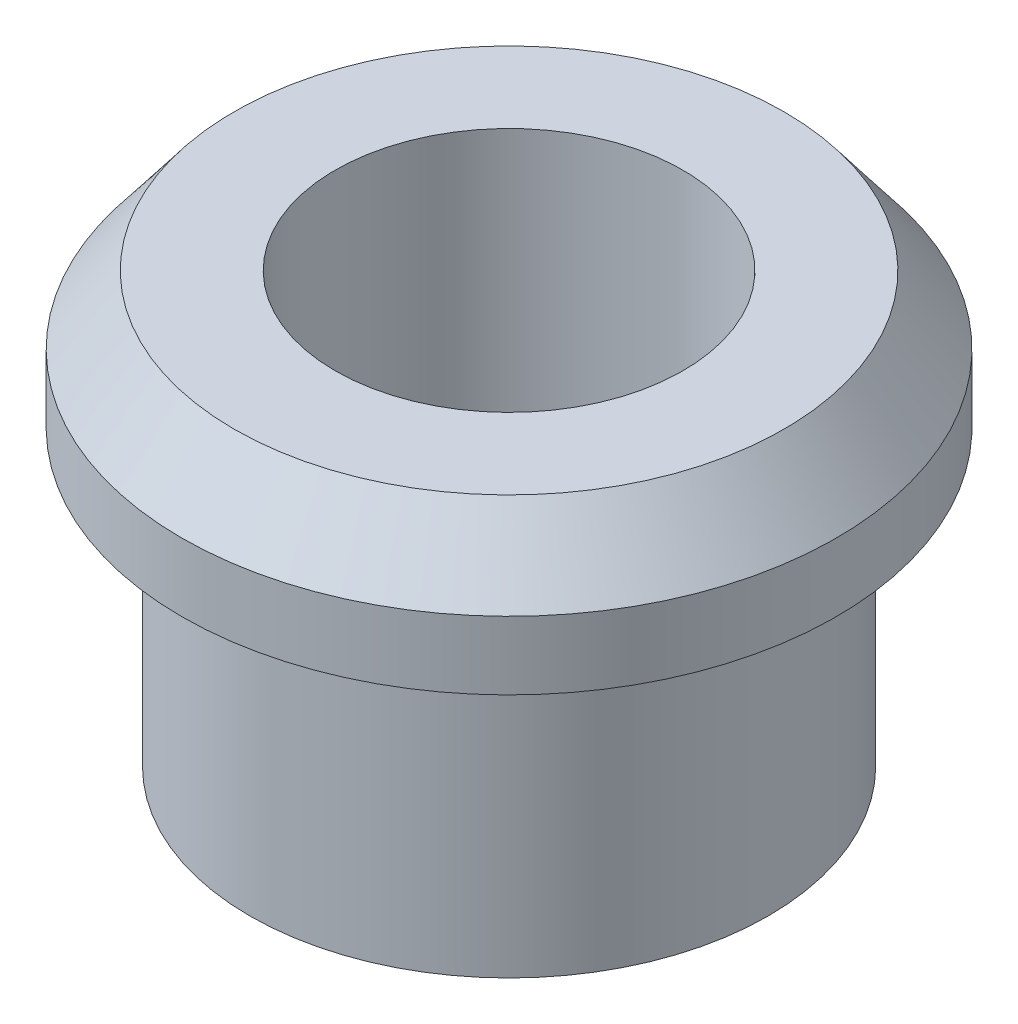
ISO-10303-21;
HEADER;
FILE_DESCRIPTION(('STEP AP214'),'2;1');
FILE_NAME('part.step','',(''),(''),'','','');
FILE_SCHEMA(('AUTOMOTIVE_DESIGN { 1 0 10303 214 1 1 1 1 }'));
ENDSEC;
DATA;
#1=APPLICATION_CONTEXT('core data for automotive mechanical design processes');
#2=APPLICATION_PROTOCOL_DEFINITION('international standard','automotive_design',2000,#1);
#3=PRODUCT_CONTEXT('',#1,'mechanical');
#4=PRODUCT('Part','Part','',(#3));
#5=PRODUCT_RELATED_PRODUCT_CATEGORY('part','',(#4));
#6=PRODUCT_DEFINITION_FORMATION('','',#4);
#7=PRODUCT_DEFINITION_CONTEXT('part definition',#1,'design');
#8=PRODUCT_DEFINITION('design','',#6,#7);
#9=PRODUCT_DEFINITION_SHAPE('','',#8);
#10=(LENGTH_UNIT() NAMED_UNIT(*) SI_UNIT(.MILLI.,.METRE.));
#11=(NAMED_UNIT(*) PLANE_ANGLE_UNIT() SI_UNIT($,.RADIAN.));
#12=(NAMED_UNIT(*) SI_UNIT($,.STERADIAN.) SOLID_ANGLE_UNIT());
#13=UNCERTAINTY_MEASURE_WITH_UNIT(LENGTH_MEASURE(1.E-05),#10,'distance_accuracy_value','');
#14=(GEOMETRIC_REPRESENTATION_CONTEXT(3) GLOBAL_UNCERTAINTY_ASSIGNED_CONTEXT((#13)) GLOBAL_UNIT_ASSIGNED_CONTEXT((#10,
#11,#12)) REPRESENTATION_CONTEXT('',''));
#15=CARTESIAN_POINT('',(0.,0.,0.));
#16=DIRECTION('',(0.,0.,1.));
#17=DIRECTION('',(1.,0.,0.));
#18=AXIS2_PLACEMENT_3D('',#15,#16,#17);
#19=CARTESIAN_POINT('',(0.,3.84731065352995,0.));
#20=DIRECTION('',(0.,-1.,0.));
#21=DIRECTION('',(0.,0.,-1.));
#22=AXIS2_PLACEMENT_3D('',#19,#20,#21);
#23=CONICAL_SURFACE('',#22,7.9375,0.655695626241537);
#24=CARTESIAN_POINT('',(0.,5.49831065352995,0.));
#25=DIRECTION('',(0.,1.,0.));
#26=DIRECTION('',(0.,0.,1.));
#27=AXIS2_PLACEMENT_3D('',#24,#25,#26);
#28=CIRCLE('',#27,6.6675);
#29=CARTESIAN_POINT('',(0.,5.49831065352995,6.6675));
#30=VERTEX_POINT('',#29);
#31=EDGE_CURVE('E64',#30,#30,#28,.T.);
#32=ORIENTED_EDGE('',*,*,#31,.F.);
#33=EDGE_LOOP('',(#32));
#34=FACE_BOUND('',#33,.T.);
#35=CARTESIAN_POINT('',(0.,3.84731065352995,0.));
#36=DIRECTION('',(0.,1.,0.));
#37=DIRECTION('',(0.,0.,1.));
#38=AXIS2_PLACEMENT_3D('',#35,#36,#37);
#39=CIRCLE('',#38,7.9375);
#40=CARTESIAN_POINT('',(0.,3.84731065352995,7.9375));
#41=VERTEX_POINT('',#40);
#42=EDGE_CURVE('E59',#41,#41,#39,.T.);
#43=ORIENTED_EDGE('',*,*,#42,.T.);
#44=EDGE_LOOP('',(#43));
#45=FACE_BOUND('',#44,.T.);
#46=ADVANCED_FACE('F43',(#34,#45),#23,.T.);
#47=CARTESIAN_POINT('',(0.,5.49831065352995,0.));
#48=DIRECTION('',(0.,-1.,0.));
#49=DIRECTION('',(0.,0.,-1.));
#50=AXIS2_PLACEMENT_3D('',#47,#48,#49);
#51=PLANE('',#50);
#52=CARTESIAN_POINT('',(0.,5.49831065352995,0.));
#53=DIRECTION('',(0.,1.,0.));
#54=DIRECTION('',(0.,0.,1.));
#55=AXIS2_PLACEMENT_3D('',#52,#53,#54);
#56=CIRCLE('',#55,4.21639999999999);
#57=CARTESIAN_POINT('',(0.,5.49831065352995,4.21639999999999));
#58=VERTEX_POINT('',#57);
#59=EDGE_CURVE('E69',#58,#58,#56,.T.);
#60=ORIENTED_EDGE('',*,*,#59,.F.);
#61=EDGE_LOOP('',(#60));
#62=FACE_BOUND('',#61,.T.);
#63=ORIENTED_EDGE('',*,*,#31,.T.);
#64=EDGE_LOOP('',(#63));
#65=FACE_BOUND('',#64,.T.);
#66=ADVANCED_FACE('F73',(#62,#65),#51,.F.);
#67=CARTESIAN_POINT('',(0.,5.49831065352995,0.));
#68=DIRECTION('',(0.,1.,0.));
#69=DIRECTION('',(0.,0.,1.));
#70=AXIS2_PLACEMENT_3D('',#67,#68,#69);
#71=CYLINDRICAL_SURFACE('',#70,7.9375);
#72=ORIENTED_EDGE('',*,*,#42,.F.);
#73=EDGE_LOOP('',(#72));
#74=FACE_BOUND('',#73,.T.);
#75=CARTESIAN_POINT('',(0.,2.19631065352995,0.));
#76=DIRECTION('',(0.,1.,0.));
#77=DIRECTION('',(0.,0.,1.));
#78=AXIS2_PLACEMENT_3D('',#75,#76,#77);
#79=CIRCLE('',#78,7.9375);
#80=CARTESIAN_POINT('',(0.,2.19631065352995,7.9375));
#81=VERTEX_POINT('',#80);
#82=EDGE_CURVE('E53',#81,#81,#79,.T.);
#83=ORIENTED_EDGE('',*,*,#82,.T.);
#84=EDGE_LOOP('',(#83));
#85=FACE_BOUND('',#84,.T.);
#86=ADVANCED_FACE('F79',(#74,#85),#71,.T.);
#87=CARTESIAN_POINT('',(0.,2.19631065352995,0.));
#88=DIRECTION('',(0.,1.,0.));
#89=DIRECTION('',(0.,0.,1.));
#90=AXIS2_PLACEMENT_3D('',#87,#88,#89);
#91=PLANE('',#90);
#92=ORIENTED_EDGE('',*,*,#82,.F.);
#93=EDGE_LOOP('',(#92));
#94=FACE_BOUND('',#93,.T.);
#95=CARTESIAN_POINT('',(0.,2.19631065352995,0.));
#96=DIRECTION('',(0.,1.,0.));
#97=DIRECTION('',(0.,0.,1.));
#98=AXIS2_PLACEMENT_3D('',#95,#96,#97);
#99=CIRCLE('',#98,6.2865);
#100=CARTESIAN_POINT('',(0.,2.19631065352995,6.2865));
#101=VERTEX_POINT('',#100);
#102=EDGE_CURVE('E49',#101,#101,#99,.T.);
#103=ORIENTED_EDGE('',*,*,#102,.T.);
#104=EDGE_LOOP('',(#103));
#105=FACE_BOUND('',#104,.T.);
#106=ADVANCED_FACE('F90',(#94,#105),#91,.F.);
#107=CARTESIAN_POINT('',(0.,5.49831065352995,0.));
#108=DIRECTION('',(0.,1.,0.));
#109=DIRECTION('',(0.,0.,1.));
#110=AXIS2_PLACEMENT_3D('',#107,#108,#109);
#111=CYLINDRICAL_SURFACE('',#110,6.2865);
#112=ORIENTED_EDGE('',*,*,#102,.F.);
#113=EDGE_LOOP('',(#112));
#114=FACE_BOUND('',#113,.T.);
#115=CARTESIAN_POINT('',(0.,-4.91568934647005,0.));
#116=DIRECTION('',(0.,1.,0.));
#117=DIRECTION('',(0.,0.,1.));
#118=AXIS2_PLACEMENT_3D('',#115,#116,#117);
#119=CIRCLE('',#118,6.2865);
#120=CARTESIAN_POINT('',(0.,-4.91568934647005,6.2865));
#121=VERTEX_POINT('',#120);
#122=EDGE_CURVE('E10',#121,#121,#119,.T.);
#123=ORIENTED_EDGE('',*,*,#122,.T.);
#124=EDGE_LOOP('',(#123));
#125=FACE_BOUND('',#124,.T.);
#126=ADVANCED_FACE('F94',(#114,#125),#111,.T.);
#127=CARTESIAN_POINT('',(0.,-4.91568934647005,0.));
#128=DIRECTION('',(0.,1.,0.));
#129=DIRECTION('',(0.,0.,1.));
#130=AXIS2_PLACEMENT_3D('',#127,#128,#129);
#131=PLANE('',#130);
#132=CARTESIAN_POINT('',(0.,-4.91568934647005,0.));
#133=DIRECTION('',(0.,1.,0.));
#134=DIRECTION('',(0.,0.,1.));
#135=AXIS2_PLACEMENT_3D('',#132,#133,#134);
#136=CIRCLE('',#135,4.2164);
#137=CARTESIAN_POINT('',(0.,-4.91568934647005,4.2164));
#138=VERTEX_POINT('',#137);
#139=EDGE_CURVE('E68',#138,#138,#136,.T.);
#140=ORIENTED_EDGE('',*,*,#139,.T.);
#141=EDGE_LOOP('',(#140));
#142=FACE_BOUND('',#141,.T.);
#143=ORIENTED_EDGE('',*,*,#122,.F.);
#144=EDGE_LOOP('',(#143));
#145=FACE_BOUND('',#144,.T.);
#146=ADVANCED_FACE('F44',(#142,#145),#131,.F.);
#147=CARTESIAN_POINT('',(0.,5.49831065352995,0.));
#148=DIRECTION('',(0.,1.,0.));
#149=DIRECTION('',(0.,0.,1.));
#150=AXIS2_PLACEMENT_3D('',#147,#148,#149);
#151=CYLINDRICAL_SURFACE('',#150,4.21639999999999);
#152=ORIENTED_EDGE('',*,*,#139,.F.);
#153=EDGE_LOOP('',(#152));
#154=FACE_BOUND('',#153,.T.);
#155=ORIENTED_EDGE('',*,*,#59,.T.);
#156=EDGE_LOOP('',(#155));
#157=FACE_BOUND('',#156,.T.);
#158=ADVANCED_FACE('F71',(#154,#157),#151,.F.);
#159=CLOSED_SHELL('',(#46,#66,#86,#106,#126,#146,#158));
#160=MANIFOLD_SOLID_BREP('B2',#159);
#161=ADVANCED_BREP_SHAPE_REPRESENTATION('',(#18,#160),#14);
#162=SHAPE_DEFINITION_REPRESENTATION(#9,#161);
ENDSEC;
END-ISO-10303-21;
